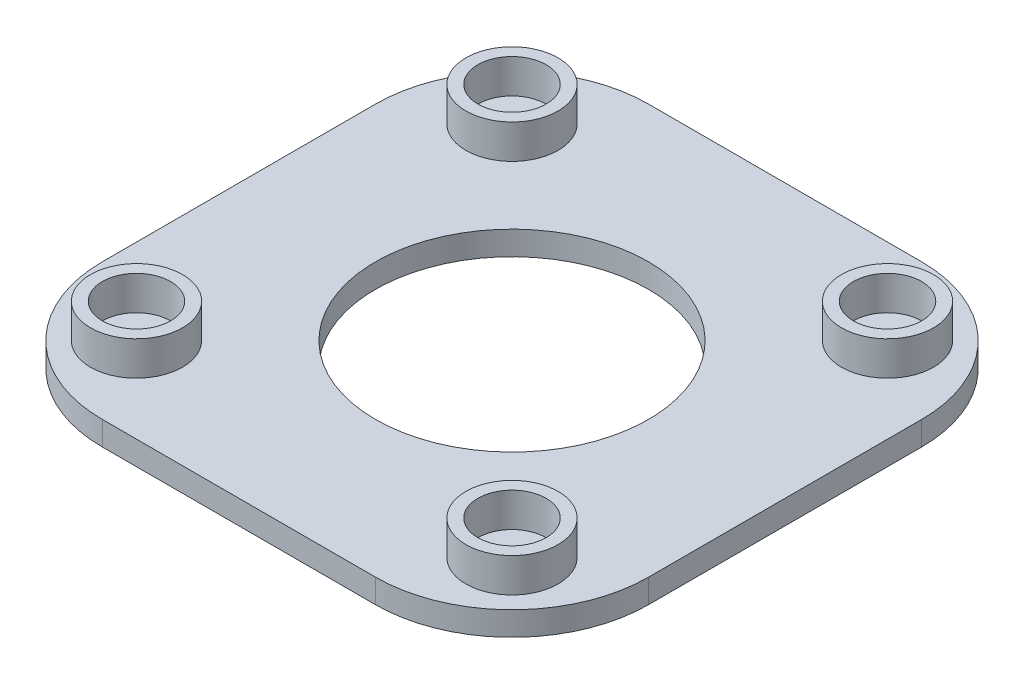
ISO-10303-21;
HEADER;
FILE_DESCRIPTION(('STEP AP214'),'2;1');
FILE_NAME('part.step','',(''),(''),'','','');
FILE_SCHEMA(('AUTOMOTIVE_DESIGN { 1 0 10303 214 1 1 1 1 }'));
ENDSEC;
DATA;
#1=APPLICATION_CONTEXT('core data for automotive mechanical design processes');
#2=APPLICATION_PROTOCOL_DEFINITION('international standard','automotive_design',2000,#1);
#3=PRODUCT_CONTEXT('',#1,'mechanical');
#4=PRODUCT('Part','Part','',(#3));
#5=PRODUCT_RELATED_PRODUCT_CATEGORY('part','',(#4));
#6=PRODUCT_DEFINITION_FORMATION('','',#4);
#7=PRODUCT_DEFINITION_CONTEXT('part definition',#1,'design');
#8=PRODUCT_DEFINITION('design','',#6,#7);
#9=PRODUCT_DEFINITION_SHAPE('','',#8);
#10=(LENGTH_UNIT() NAMED_UNIT(*) SI_UNIT(.MILLI.,.METRE.));
#11=(NAMED_UNIT(*) PLANE_ANGLE_UNIT() SI_UNIT($,.RADIAN.));
#12=(NAMED_UNIT(*) SI_UNIT($,.STERADIAN.) SOLID_ANGLE_UNIT());
#13=UNCERTAINTY_MEASURE_WITH_UNIT(LENGTH_MEASURE(1.E-05),#10,'distance_accuracy_value','');
#14=(GEOMETRIC_REPRESENTATION_CONTEXT(3) GLOBAL_UNCERTAINTY_ASSIGNED_CONTEXT((#13)) GLOBAL_UNIT_ASSIGNED_CONTEXT((#10,
#11,#12)) REPRESENTATION_CONTEXT('',''));
#15=CARTESIAN_POINT('',(0.,0.,0.));
#16=DIRECTION('',(0.,0.,1.));
#17=DIRECTION('',(1.,0.,0.));
#18=AXIS2_PLACEMENT_3D('',#15,#16,#17);
#19=CARTESIAN_POINT('',(400.,70.,-400.));
#20=DIRECTION('',(0.,1.,0.));
#21=DIRECTION('',(0.,0.,1.));
#22=AXIS2_PLACEMENT_3D('',#19,#20,#21);
#23=PLANE('',#22);
#24=CARTESIAN_POINT('',(550.,70.,550.));
#25=DIRECTION('',(0.,1.,0.));
#26=DIRECTION('',(0.,0.,1.));
#27=AXIS2_PLACEMENT_3D('',#24,#25,#26);
#28=CIRCLE('',#27,135.);
#29=CARTESIAN_POINT('',(550.,70.,685.));
#30=VERTEX_POINT('',#29);
#31=EDGE_CURVE('E426',#30,#30,#28,.T.);
#32=ORIENTED_EDGE('',*,*,#31,.F.);
#33=EDGE_LOOP('',(#32));
#34=FACE_BOUND('',#33,.T.);
#35=CARTESIAN_POINT('',(-550.,70.,550.));
#36=DIRECTION('',(0.,1.,0.));
#37=DIRECTION('',(0.,0.,1.));
#38=AXIS2_PLACEMENT_3D('',#35,#36,#37);
#39=CIRCLE('',#38,135.);
#40=CARTESIAN_POINT('',(-550.,70.,685.));
#41=VERTEX_POINT('',#40);
#42=EDGE_CURVE('E437',#41,#41,#39,.T.);
#43=ORIENTED_EDGE('',*,*,#42,.F.);
#44=EDGE_LOOP('',(#43));
#45=FACE_BOUND('',#44,.T.);
#46=CARTESIAN_POINT('',(550.,70.,-550.));
#47=DIRECTION('',(0.,1.,0.));
#48=DIRECTION('',(0.,0.,1.));
#49=AXIS2_PLACEMENT_3D('',#46,#47,#48);
#50=CIRCLE('',#49,135.);
#51=CARTESIAN_POINT('',(550.,70.,-415.));
#52=VERTEX_POINT('',#51);
#53=EDGE_CURVE('E446',#52,#52,#50,.T.);
#54=ORIENTED_EDGE('',*,*,#53,.F.);
#55=EDGE_LOOP('',(#54));
#56=FACE_BOUND('',#55,.T.);
#57=CARTESIAN_POINT('',(-550.,70.,-550.));
#58=DIRECTION('',(0.,1.,0.));
#59=DIRECTION('',(0.,0.,1.));
#60=AXIS2_PLACEMENT_3D('',#57,#58,#59);
#61=CIRCLE('',#60,135.);
#62=CARTESIAN_POINT('',(-550.,70.,-415.));
#63=VERTEX_POINT('',#62);
#64=EDGE_CURVE('E252',#63,#63,#61,.T.);
#65=ORIENTED_EDGE('',*,*,#64,.F.);
#66=EDGE_LOOP('',(#65));
#67=FACE_BOUND('',#66,.T.);
#68=CARTESIAN_POINT('',(400.,70.,-400.));
#69=DIRECTION('',(0.,1.,0.));
#70=DIRECTION('',(0.,0.,1.));
#71=AXIS2_PLACEMENT_3D('',#68,#69,#70);
#72=CIRCLE('',#71,400.);
#73=CARTESIAN_POINT('',(800.,70.,-399.999999999997));
#74=VERTEX_POINT('',#73);
#75=CARTESIAN_POINT('',(399.999999999997,70.,-800.));
#76=VERTEX_POINT('',#75);
#77=EDGE_CURVE('E146',#74,#76,#72,.T.);
#78=ORIENTED_EDGE('',*,*,#77,.T.);
#79=DIRECTION('',(-1.,0.,0.));
#80=VECTOR('',#79,1.);
#81=CARTESIAN_POINT('',(399.999999999997,70.,-800.));
#82=LINE('',#81,#80);
#83=CARTESIAN_POINT('',(-400.,70.,-800.));
#84=VERTEX_POINT('',#83);
#85=EDGE_CURVE('E94',#76,#84,#82,.T.);
#86=ORIENTED_EDGE('',*,*,#85,.T.);
#87=CARTESIAN_POINT('',(-400.,70.,-400.));
#88=DIRECTION('',(0.,1.,0.));
#89=DIRECTION('',(0.,0.,-1.));
#90=AXIS2_PLACEMENT_3D('',#87,#88,#89);
#91=CIRCLE('',#90,400.);
#92=CARTESIAN_POINT('',(-800.,70.,-399.999999999997));
#93=VERTEX_POINT('',#92);
#94=EDGE_CURVE('E258',#84,#93,#91,.T.);
#95=ORIENTED_EDGE('',*,*,#94,.T.);
#96=DIRECTION('',(0.,0.,1.));
#97=VECTOR('',#96,1.);
#98=CARTESIAN_POINT('',(-800.,70.,-399.999999999997));
#99=LINE('',#98,#97);
#100=CARTESIAN_POINT('',(-800.,70.,399.999999999997));
#101=VERTEX_POINT('',#100);
#102=EDGE_CURVE('E260',#93,#101,#99,.T.);
#103=ORIENTED_EDGE('',*,*,#102,.T.);
#104=CARTESIAN_POINT('',(-400.,70.,400.));
#105=DIRECTION('',(0.,1.,0.));
#106=DIRECTION('',(0.,0.,1.));
#107=AXIS2_PLACEMENT_3D('',#104,#105,#106);
#108=CIRCLE('',#107,400.);
#109=CARTESIAN_POINT('',(-399.999999999997,70.,800.));
#110=VERTEX_POINT('',#109);
#111=EDGE_CURVE('E113',#101,#110,#108,.T.);
#112=ORIENTED_EDGE('',*,*,#111,.T.);
#113=DIRECTION('',(1.,0.,0.));
#114=VECTOR('',#113,1.);
#115=CARTESIAN_POINT('',(-399.999999999997,70.,800.));
#116=LINE('',#115,#114);
#117=CARTESIAN_POINT('',(399.999999999997,70.,800.));
#118=VERTEX_POINT('',#117);
#119=EDGE_CURVE('E107',#110,#118,#116,.T.);
#120=ORIENTED_EDGE('',*,*,#119,.T.);
#121=CARTESIAN_POINT('',(400.,70.,400.));
#122=DIRECTION('',(0.,1.,0.));
#123=DIRECTION('',(0.,0.,-1.));
#124=AXIS2_PLACEMENT_3D('',#121,#122,#123);
#125=CIRCLE('',#124,400.);
#126=CARTESIAN_POINT('',(800.,70.,399.999999999997));
#127=VERTEX_POINT('',#126);
#128=EDGE_CURVE('E111',#118,#127,#125,.T.);
#129=ORIENTED_EDGE('',*,*,#128,.T.);
#130=DIRECTION('',(0.,0.,-1.));
#131=VECTOR('',#130,1.);
#132=CARTESIAN_POINT('',(800.,70.,-399.999999999997));
#133=LINE('',#132,#131);
#134=EDGE_CURVE('E50',#127,#74,#133,.T.);
#135=ORIENTED_EDGE('',*,*,#134,.T.);
#136=EDGE_LOOP('',(#78,#86,#95,#103,#112,#120,#129,#135));
#137=FACE_BOUND('',#136,.T.);
#138=CARTESIAN_POINT('',(0.,70.,0.));
#139=DIRECTION('',(0.,1.,0.));
#140=DIRECTION('',(0.,0.,1.));
#141=AXIS2_PLACEMENT_3D('',#138,#139,#140);
#142=CIRCLE('',#141,400.);
#143=CARTESIAN_POINT('',(0.,70.,400.));
#144=VERTEX_POINT('',#143);
#145=EDGE_CURVE('E135',#144,#144,#142,.T.);
#146=ORIENTED_EDGE('',*,*,#145,.F.);
#147=EDGE_LOOP('',(#146));
#148=FACE_BOUND('',#147,.T.);
#149=ADVANCED_FACE('F33',(#34,#45,#56,#67,#137,#148),#23,.T.);
#150=CARTESIAN_POINT('',(400.,0.,-400.));
#151=DIRECTION('',(0.,1.,0.));
#152=DIRECTION('',(0.,0.,1.));
#153=AXIS2_PLACEMENT_3D('',#150,#151,#152);
#154=PLANE('',#153);
#155=CARTESIAN_POINT('',(400.,0.,-400.));
#156=DIRECTION('',(0.,1.,0.));
#157=DIRECTION('',(0.,0.,1.));
#158=AXIS2_PLACEMENT_3D('',#155,#156,#157);
#159=CIRCLE('',#158,400.);
#160=CARTESIAN_POINT('',(800.,0.,-399.999999999997));
#161=VERTEX_POINT('',#160);
#162=CARTESIAN_POINT('',(399.999999999997,0.,-800.));
#163=VERTEX_POINT('',#162);
#164=EDGE_CURVE('E131',#161,#163,#159,.T.);
#165=ORIENTED_EDGE('',*,*,#164,.F.);
#166=DIRECTION('',(0.,0.,-1.));
#167=VECTOR('',#166,1.);
#168=CARTESIAN_POINT('',(800.,0.,-399.999999999997));
#169=LINE('',#168,#167);
#170=CARTESIAN_POINT('',(800.,0.,399.999999999997));
#171=VERTEX_POINT('',#170);
#172=EDGE_CURVE('E85',#171,#161,#169,.T.);
#173=ORIENTED_EDGE('',*,*,#172,.F.);
#174=CARTESIAN_POINT('',(400.,0.,400.));
#175=DIRECTION('',(0.,1.,0.));
#176=DIRECTION('',(0.,0.,-1.));
#177=AXIS2_PLACEMENT_3D('',#174,#175,#176);
#178=CIRCLE('',#177,400.);
#179=CARTESIAN_POINT('',(399.999999999997,0.,800.));
#180=VERTEX_POINT('',#179);
#181=EDGE_CURVE('E79',#180,#171,#178,.T.);
#182=ORIENTED_EDGE('',*,*,#181,.F.);
#183=DIRECTION('',(1.,0.,0.));
#184=VECTOR('',#183,1.);
#185=CARTESIAN_POINT('',(-399.999999999997,0.,800.));
#186=LINE('',#185,#184);
#187=CARTESIAN_POINT('',(-399.999999999997,0.,800.));
#188=VERTEX_POINT('',#187);
#189=EDGE_CURVE('E121',#188,#180,#186,.T.);
#190=ORIENTED_EDGE('',*,*,#189,.F.);
#191=CARTESIAN_POINT('',(-400.,0.,400.));
#192=DIRECTION('',(0.,1.,0.));
#193=DIRECTION('',(0.,0.,1.));
#194=AXIS2_PLACEMENT_3D('',#191,#192,#193);
#195=CIRCLE('',#194,400.);
#196=CARTESIAN_POINT('',(-800.,0.,399.999999999997));
#197=VERTEX_POINT('',#196);
#198=EDGE_CURVE('E141',#197,#188,#195,.T.);
#199=ORIENTED_EDGE('',*,*,#198,.F.);
#200=DIRECTION('',(0.,0.,1.));
#201=VECTOR('',#200,1.);
#202=CARTESIAN_POINT('',(-800.,0.,-399.999999999997));
#203=LINE('',#202,#201);
#204=CARTESIAN_POINT('',(-800.,0.,-399.999999999997));
#205=VERTEX_POINT('',#204);
#206=EDGE_CURVE('E139',#205,#197,#203,.T.);
#207=ORIENTED_EDGE('',*,*,#206,.F.);
#208=CARTESIAN_POINT('',(-400.,0.,-400.));
#209=DIRECTION('',(0.,1.,0.));
#210=DIRECTION('',(0.,0.,-1.));
#211=AXIS2_PLACEMENT_3D('',#208,#209,#210);
#212=CIRCLE('',#211,400.);
#213=CARTESIAN_POINT('',(-400.,0.,-800.));
#214=VERTEX_POINT('',#213);
#215=EDGE_CURVE('E137',#214,#205,#212,.T.);
#216=ORIENTED_EDGE('',*,*,#215,.F.);
#217=DIRECTION('',(-1.,0.,0.));
#218=VECTOR('',#217,1.);
#219=CARTESIAN_POINT('',(399.999999999997,0.,-800.));
#220=LINE('',#219,#218);
#221=EDGE_CURVE('E134',#163,#214,#220,.T.);
#222=ORIENTED_EDGE('',*,*,#221,.F.);
#223=EDGE_LOOP('',(#165,#173,#182,#190,#199,#207,#216,#222));
#224=FACE_BOUND('',#223,.T.);
#225=CARTESIAN_POINT('',(0.,0.,0.));
#226=DIRECTION('',(0.,1.,0.));
#227=DIRECTION('',(0.,0.,1.));
#228=AXIS2_PLACEMENT_3D('',#225,#226,#227);
#229=CIRCLE('',#228,400.);
#230=CARTESIAN_POINT('',(0.,0.,400.));
#231=VERTEX_POINT('',#230);
#232=EDGE_CURVE('E246',#231,#231,#229,.T.);
#233=ORIENTED_EDGE('',*,*,#232,.T.);
#234=EDGE_LOOP('',(#233));
#235=FACE_BOUND('',#234,.T.);
#236=ADVANCED_FACE('F198',(#224,#235),#154,.F.);
#237=CARTESIAN_POINT('',(400.,70.,-400.));
#238=DIRECTION('',(0.,-1.,0.));
#239=DIRECTION('',(0.,0.,-1.));
#240=AXIS2_PLACEMENT_3D('',#237,#238,#239);
#241=CYLINDRICAL_SURFACE('',#240,400.);
#242=ORIENTED_EDGE('',*,*,#164,.T.);
#243=DIRECTION('',(0.,-1.,0.));
#244=VECTOR('',#243,1.);
#245=CARTESIAN_POINT('',(399.999999999997,70.,-800.));
#246=LINE('',#245,#244);
#247=EDGE_CURVE('E159',#76,#163,#246,.T.);
#248=ORIENTED_EDGE('',*,*,#247,.F.);
#249=ORIENTED_EDGE('',*,*,#77,.F.);
#250=DIRECTION('',(0.,-1.,0.));
#251=VECTOR('',#250,1.);
#252=CARTESIAN_POINT('',(800.,70.,-399.999999999997));
#253=LINE('',#252,#251);
#254=EDGE_CURVE('E127',#74,#161,#253,.T.);
#255=ORIENTED_EDGE('',*,*,#254,.T.);
#256=EDGE_LOOP('',(#242,#248,#249,#255));
#257=FACE_BOUND('',#256,.T.);
#258=ADVANCED_FACE('F35',(#257),#241,.T.);
#259=CARTESIAN_POINT('',(399.999999999997,70.,-800.));
#260=DIRECTION('',(0.,0.,1.));
#261=DIRECTION('',(1.,0.,0.));
#262=AXIS2_PLACEMENT_3D('',#259,#260,#261);
#263=PLANE('',#262);
#264=ORIENTED_EDGE('',*,*,#221,.T.);
#265=DIRECTION('',(0.,-1.,0.));
#266=VECTOR('',#265,1.);
#267=CARTESIAN_POINT('',(-400.,70.,-800.));
#268=LINE('',#267,#266);
#269=EDGE_CURVE('E156',#84,#214,#268,.T.);
#270=ORIENTED_EDGE('',*,*,#269,.F.);
#271=ORIENTED_EDGE('',*,*,#85,.F.);
#272=ORIENTED_EDGE('',*,*,#247,.T.);
#273=EDGE_LOOP('',(#264,#270,#271,#272));
#274=FACE_BOUND('',#273,.T.);
#275=ADVANCED_FACE('F276',(#274),#263,.F.);
#276=CARTESIAN_POINT('',(-400.,70.,-400.));
#277=DIRECTION('',(0.,-1.,0.));
#278=DIRECTION('',(0.,0.,-1.));
#279=AXIS2_PLACEMENT_3D('',#276,#277,#278);
#280=CYLINDRICAL_SURFACE('',#279,400.);
#281=ORIENTED_EDGE('',*,*,#215,.T.);
#282=DIRECTION('',(0.,-1.,0.));
#283=VECTOR('',#282,1.);
#284=CARTESIAN_POINT('',(-800.,70.,-399.999999999997));
#285=LINE('',#284,#283);
#286=EDGE_CURVE('E153',#93,#205,#285,.T.);
#287=ORIENTED_EDGE('',*,*,#286,.F.);
#288=ORIENTED_EDGE('',*,*,#94,.F.);
#289=ORIENTED_EDGE('',*,*,#269,.T.);
#290=EDGE_LOOP('',(#281,#287,#288,#289));
#291=FACE_BOUND('',#290,.T.);
#292=ADVANCED_FACE('F278',(#291),#280,.T.);
#293=CARTESIAN_POINT('',(-800.,70.,-399.999999999997));
#294=DIRECTION('',(1.,0.,0.));
#295=DIRECTION('',(0.,0.,-1.));
#296=AXIS2_PLACEMENT_3D('',#293,#294,#295);
#297=PLANE('',#296);
#298=ORIENTED_EDGE('',*,*,#206,.T.);
#299=DIRECTION('',(0.,-1.,0.));
#300=VECTOR('',#299,1.);
#301=CARTESIAN_POINT('',(-800.,70.,399.999999999997));
#302=LINE('',#301,#300);
#303=EDGE_CURVE('E150',#101,#197,#302,.T.);
#304=ORIENTED_EDGE('',*,*,#303,.F.);
#305=ORIENTED_EDGE('',*,*,#102,.F.);
#306=ORIENTED_EDGE('',*,*,#286,.T.);
#307=EDGE_LOOP('',(#298,#304,#305,#306));
#308=FACE_BOUND('',#307,.T.);
#309=ADVANCED_FACE('F266',(#308),#297,.F.);
#310=CARTESIAN_POINT('',(-400.,70.,400.));
#311=DIRECTION('',(0.,-1.,0.));
#312=DIRECTION('',(0.,0.,-1.));
#313=AXIS2_PLACEMENT_3D('',#310,#311,#312);
#314=CYLINDRICAL_SURFACE('',#313,400.);
#315=ORIENTED_EDGE('',*,*,#198,.T.);
#316=DIRECTION('',(0.,-1.,0.));
#317=VECTOR('',#316,1.);
#318=CARTESIAN_POINT('',(-399.999999999997,70.,800.));
#319=LINE('',#318,#317);
#320=EDGE_CURVE('E122',#110,#188,#319,.T.);
#321=ORIENTED_EDGE('',*,*,#320,.F.);
#322=ORIENTED_EDGE('',*,*,#111,.F.);
#323=ORIENTED_EDGE('',*,*,#303,.T.);
#324=EDGE_LOOP('',(#315,#321,#322,#323));
#325=FACE_BOUND('',#324,.T.);
#326=ADVANCED_FACE('F270',(#325),#314,.T.);
#327=CARTESIAN_POINT('',(-399.999999999997,70.,800.));
#328=DIRECTION('',(0.,0.,-1.));
#329=DIRECTION('',(-1.,0.,0.));
#330=AXIS2_PLACEMENT_3D('',#327,#328,#329);
#331=PLANE('',#330);
#332=ORIENTED_EDGE('',*,*,#189,.T.);
#333=DIRECTION('',(0.,-1.,0.));
#334=VECTOR('',#333,1.);
#335=CARTESIAN_POINT('',(399.999999999997,70.,800.));
#336=LINE('',#335,#334);
#337=EDGE_CURVE('E118',#118,#180,#336,.T.);
#338=ORIENTED_EDGE('',*,*,#337,.F.);
#339=ORIENTED_EDGE('',*,*,#119,.F.);
#340=ORIENTED_EDGE('',*,*,#320,.T.);
#341=EDGE_LOOP('',(#332,#338,#339,#340));
#342=FACE_BOUND('',#341,.T.);
#343=ADVANCED_FACE('F119',(#342),#331,.F.);
#344=CARTESIAN_POINT('',(400.,70.,400.));
#345=DIRECTION('',(0.,-1.,0.));
#346=DIRECTION('',(0.,0.,-1.));
#347=AXIS2_PLACEMENT_3D('',#344,#345,#346);
#348=CYLINDRICAL_SURFACE('',#347,400.);
#349=ORIENTED_EDGE('',*,*,#181,.T.);
#350=DIRECTION('',(0.,-1.,0.));
#351=VECTOR('',#350,1.);
#352=CARTESIAN_POINT('',(800.,70.,399.999999999997));
#353=LINE('',#352,#351);
#354=EDGE_CURVE('E123',#127,#171,#353,.T.);
#355=ORIENTED_EDGE('',*,*,#354,.F.);
#356=ORIENTED_EDGE('',*,*,#128,.F.);
#357=ORIENTED_EDGE('',*,*,#337,.T.);
#358=EDGE_LOOP('',(#349,#355,#356,#357));
#359=FACE_BOUND('',#358,.T.);
#360=ADVANCED_FACE('F125',(#359),#348,.T.);
#361=CARTESIAN_POINT('',(800.,70.,-399.999999999997));
#362=DIRECTION('',(-1.,0.,0.));
#363=DIRECTION('',(0.,0.,1.));
#364=AXIS2_PLACEMENT_3D('',#361,#362,#363);
#365=PLANE('',#364);
#366=ORIENTED_EDGE('',*,*,#172,.T.);
#367=ORIENTED_EDGE('',*,*,#254,.F.);
#368=ORIENTED_EDGE('',*,*,#134,.F.);
#369=ORIENTED_EDGE('',*,*,#354,.T.);
#370=EDGE_LOOP('',(#366,#367,#368,#369));
#371=FACE_BOUND('',#370,.T.);
#372=ADVANCED_FACE('F235',(#371),#365,.F.);
#373=CARTESIAN_POINT('',(0.,70.,0.));
#374=DIRECTION('',(0.,-1.,0.));
#375=DIRECTION('',(0.,0.,-1.));
#376=AXIS2_PLACEMENT_3D('',#373,#374,#375);
#377=CYLINDRICAL_SURFACE('',#376,400.);
#378=ORIENTED_EDGE('',*,*,#145,.T.);
#379=EDGE_LOOP('',(#378));
#380=FACE_BOUND('',#379,.T.);
#381=ORIENTED_EDGE('',*,*,#232,.F.);
#382=EDGE_LOOP('',(#381));
#383=FACE_BOUND('',#382,.T.);
#384=ADVANCED_FACE('F232',(#380,#383),#377,.F.);
#385=CARTESIAN_POINT('',(-550.,170.,-550.));
#386=DIRECTION('',(0.,1.,0.));
#387=DIRECTION('',(0.,0.,1.));
#388=AXIS2_PLACEMENT_3D('',#385,#386,#387);
#389=PLANE('',#388);
#390=CARTESIAN_POINT('',(-550.,170.,-550.));
#391=DIRECTION('',(0.,1.,0.));
#392=DIRECTION('',(0.,0.,1.));
#393=AXIS2_PLACEMENT_3D('',#390,#391,#392);
#394=CIRCLE('',#393,135.);
#395=CARTESIAN_POINT('',(-550.,170.,-415.));
#396=VERTEX_POINT('',#395);
#397=EDGE_CURVE('E248',#396,#396,#394,.T.);
#398=ORIENTED_EDGE('',*,*,#397,.T.);
#399=EDGE_LOOP('',(#398));
#400=FACE_BOUND('',#399,.T.);
#401=CARTESIAN_POINT('',(-550.,170.,-550.));
#402=DIRECTION('',(0.,1.,0.));
#403=DIRECTION('',(0.,0.,1.));
#404=AXIS2_PLACEMENT_3D('',#401,#402,#403);
#405=CIRCLE('',#404,100.);
#406=CARTESIAN_POINT('',(-550.,170.,-450.));
#407=VERTEX_POINT('',#406);
#408=EDGE_CURVE('E450',#407,#407,#405,.T.);
#409=ORIENTED_EDGE('',*,*,#408,.F.);
#410=EDGE_LOOP('',(#409));
#411=FACE_BOUND('',#410,.T.);
#412=ADVANCED_FACE('F225',(#400,#411),#389,.T.);
#413=CARTESIAN_POINT('',(-550.,170.,-550.));
#414=DIRECTION('',(0.,-1.,0.));
#415=DIRECTION('',(0.,0.,-1.));
#416=AXIS2_PLACEMENT_3D('',#413,#414,#415);
#417=CYLINDRICAL_SURFACE('',#416,135.);
#418=ORIENTED_EDGE('',*,*,#397,.F.);
#419=EDGE_LOOP('',(#418));
#420=FACE_BOUND('',#419,.T.);
#421=ORIENTED_EDGE('',*,*,#64,.T.);
#422=EDGE_LOOP('',(#421));
#423=FACE_BOUND('',#422,.T.);
#424=ADVANCED_FACE('F217',(#420,#423),#417,.T.);
#425=CARTESIAN_POINT('',(-550.,170.,-550.));
#426=DIRECTION('',(0.,-1.,0.));
#427=DIRECTION('',(0.,0.,-1.));
#428=AXIS2_PLACEMENT_3D('',#425,#426,#427);
#429=CYLINDRICAL_SURFACE('',#428,100.);
#430=ORIENTED_EDGE('',*,*,#408,.T.);
#431=EDGE_LOOP('',(#430));
#432=FACE_BOUND('',#431,.T.);
#433=CARTESIAN_POINT('',(-550.,70.,-550.));
#434=DIRECTION('',(0.,1.,0.));
#435=DIRECTION('',(0.,0.,1.));
#436=AXIS2_PLACEMENT_3D('',#433,#434,#435);
#437=CIRCLE('',#436,100.);
#438=CARTESIAN_POINT('',(-550.,70.,-450.));
#439=VERTEX_POINT('',#438);
#440=EDGE_CURVE('E161',#439,#439,#437,.F.);
#441=ORIENTED_EDGE('',*,*,#440,.T.);
#442=EDGE_LOOP('',(#441));
#443=FACE_BOUND('',#442,.T.);
#444=ADVANCED_FACE('F208',(#432,#443),#429,.F.);
#445=ORIENTED_EDGE('',*,*,#440,.F.);
#446=EDGE_LOOP('',(#445));
#447=FACE_BOUND('',#446,.T.);
#448=ADVANCED_FACE('F193',(#447),#23,.T.);
#449=CARTESIAN_POINT('',(550.,170.,-550.));
#450=DIRECTION('',(0.,1.,0.));
#451=DIRECTION('',(0.,0.,1.));
#452=AXIS2_PLACEMENT_3D('',#449,#450,#451);
#453=PLANE('',#452);
#454=CARTESIAN_POINT('',(550.,170.,-550.));
#455=DIRECTION('',(0.,1.,0.));
#456=DIRECTION('',(0.,0.,1.));
#457=AXIS2_PLACEMENT_3D('',#454,#455,#456);
#458=CIRCLE('',#457,135.);
#459=CARTESIAN_POINT('',(550.,170.,-415.));
#460=VERTEX_POINT('',#459);
#461=EDGE_CURVE('E447',#460,#460,#458,.T.);
#462=ORIENTED_EDGE('',*,*,#461,.T.);
#463=EDGE_LOOP('',(#462));
#464=FACE_BOUND('',#463,.T.);
#465=CARTESIAN_POINT('',(550.,170.,-550.));
#466=DIRECTION('',(0.,1.,0.));
#467=DIRECTION('',(0.,0.,1.));
#468=AXIS2_PLACEMENT_3D('',#465,#466,#467);
#469=CIRCLE('',#468,100.);
#470=CARTESIAN_POINT('',(550.,170.,-450.));
#471=VERTEX_POINT('',#470);
#472=EDGE_CURVE('E441',#471,#471,#469,.T.);
#473=ORIENTED_EDGE('',*,*,#472,.F.);
#474=EDGE_LOOP('',(#473));
#475=FACE_BOUND('',#474,.T.);
#476=ADVANCED_FACE('F207',(#464,#475),#453,.T.);
#477=CARTESIAN_POINT('',(550.,170.,-550.));
#478=DIRECTION('',(0.,-1.,0.));
#479=DIRECTION('',(0.,0.,-1.));
#480=AXIS2_PLACEMENT_3D('',#477,#478,#479);
#481=CYLINDRICAL_SURFACE('',#480,135.);
#482=ORIENTED_EDGE('',*,*,#461,.F.);
#483=EDGE_LOOP('',(#482));
#484=FACE_BOUND('',#483,.T.);
#485=ORIENTED_EDGE('',*,*,#53,.T.);
#486=EDGE_LOOP('',(#485));
#487=FACE_BOUND('',#486,.T.);
#488=ADVANCED_FACE('F214',(#484,#487),#481,.T.);
#489=CARTESIAN_POINT('',(550.,170.,-550.));
#490=DIRECTION('',(0.,-1.,0.));
#491=DIRECTION('',(0.,0.,-1.));
#492=AXIS2_PLACEMENT_3D('',#489,#490,#491);
#493=CYLINDRICAL_SURFACE('',#492,100.);
#494=ORIENTED_EDGE('',*,*,#472,.T.);
#495=EDGE_LOOP('',(#494));
#496=FACE_BOUND('',#495,.T.);
#497=CARTESIAN_POINT('',(550.,70.,-550.));
#498=DIRECTION('',(0.,1.,0.));
#499=DIRECTION('',(0.,0.,1.));
#500=AXIS2_PLACEMENT_3D('',#497,#498,#499);
#501=CIRCLE('',#500,100.);
#502=CARTESIAN_POINT('',(550.,70.,-450.));
#503=VERTEX_POINT('',#502);
#504=EDGE_CURVE('E164',#503,#503,#501,.F.);
#505=ORIENTED_EDGE('',*,*,#504,.T.);
#506=EDGE_LOOP('',(#505));
#507=FACE_BOUND('',#506,.T.);
#508=ADVANCED_FACE('F191',(#496,#507),#493,.F.);
#509=ORIENTED_EDGE('',*,*,#504,.F.);
#510=EDGE_LOOP('',(#509));
#511=FACE_BOUND('',#510,.T.);
#512=ADVANCED_FACE('F175',(#511),#23,.T.);
#513=CARTESIAN_POINT('',(-550.,170.,550.));
#514=DIRECTION('',(0.,1.,0.));
#515=DIRECTION('',(0.,0.,1.));
#516=AXIS2_PLACEMENT_3D('',#513,#514,#515);
#517=PLANE('',#516);
#518=CARTESIAN_POINT('',(-550.,170.,550.));
#519=DIRECTION('',(0.,1.,0.));
#520=DIRECTION('',(0.,0.,1.));
#521=AXIS2_PLACEMENT_3D('',#518,#519,#520);
#522=CIRCLE('',#521,135.);
#523=CARTESIAN_POINT('',(-550.,170.,685.));
#524=VERTEX_POINT('',#523);
#525=EDGE_CURVE('E438',#524,#524,#522,.T.);
#526=ORIENTED_EDGE('',*,*,#525,.T.);
#527=EDGE_LOOP('',(#526));
#528=FACE_BOUND('',#527,.T.);
#529=CARTESIAN_POINT('',(-550.,170.,550.));
#530=DIRECTION('',(0.,1.,0.));
#531=DIRECTION('',(0.,0.,1.));
#532=AXIS2_PLACEMENT_3D('',#529,#530,#531);
#533=CIRCLE('',#532,100.);
#534=CARTESIAN_POINT('',(-550.,170.,650.));
#535=VERTEX_POINT('',#534);
#536=EDGE_CURVE('E433',#535,#535,#533,.T.);
#537=ORIENTED_EDGE('',*,*,#536,.F.);
#538=EDGE_LOOP('',(#537));
#539=FACE_BOUND('',#538,.T.);
#540=ADVANCED_FACE('F190',(#528,#539),#517,.T.);
#541=CARTESIAN_POINT('',(-550.,170.,550.));
#542=DIRECTION('',(0.,-1.,0.));
#543=DIRECTION('',(0.,0.,-1.));
#544=AXIS2_PLACEMENT_3D('',#541,#542,#543);
#545=CYLINDRICAL_SURFACE('',#544,135.);
#546=ORIENTED_EDGE('',*,*,#525,.F.);
#547=EDGE_LOOP('',(#546));
#548=FACE_BOUND('',#547,.T.);
#549=ORIENTED_EDGE('',*,*,#42,.T.);
#550=EDGE_LOOP('',(#549));
#551=FACE_BOUND('',#550,.T.);
#552=ADVANCED_FACE('F184',(#548,#551),#545,.T.);
#553=CARTESIAN_POINT('',(-550.,170.,550.));
#554=DIRECTION('',(0.,-1.,0.));
#555=DIRECTION('',(0.,0.,-1.));
#556=AXIS2_PLACEMENT_3D('',#553,#554,#555);
#557=CYLINDRICAL_SURFACE('',#556,100.);
#558=ORIENTED_EDGE('',*,*,#536,.T.);
#559=EDGE_LOOP('',(#558));
#560=FACE_BOUND('',#559,.T.);
#561=CARTESIAN_POINT('',(-550.,70.,550.));
#562=DIRECTION('',(0.,1.,0.));
#563=DIRECTION('',(0.,0.,1.));
#564=AXIS2_PLACEMENT_3D('',#561,#562,#563);
#565=CIRCLE('',#564,100.);
#566=CARTESIAN_POINT('',(-550.,70.,650.));
#567=VERTEX_POINT('',#566);
#568=EDGE_CURVE('E42',#567,#567,#565,.F.);
#569=ORIENTED_EDGE('',*,*,#568,.T.);
#570=EDGE_LOOP('',(#569));
#571=FACE_BOUND('',#570,.T.);
#572=ADVANCED_FACE('F169',(#560,#571),#557,.F.);
#573=ORIENTED_EDGE('',*,*,#568,.F.);
#574=EDGE_LOOP('',(#573));
#575=FACE_BOUND('',#574,.T.);
#576=ADVANCED_FACE('F171',(#575),#23,.T.);
#577=CARTESIAN_POINT('',(550.,170.,550.));
#578=DIRECTION('',(0.,1.,0.));
#579=DIRECTION('',(0.,0.,1.));
#580=AXIS2_PLACEMENT_3D('',#577,#578,#579);
#581=PLANE('',#580);
#582=CARTESIAN_POINT('',(550.,170.,550.));
#583=DIRECTION('',(0.,1.,0.));
#584=DIRECTION('',(0.,0.,1.));
#585=AXIS2_PLACEMENT_3D('',#582,#583,#584);
#586=CIRCLE('',#585,135.);
#587=CARTESIAN_POINT('',(550.,170.,685.));
#588=VERTEX_POINT('',#587);
#589=EDGE_CURVE('E429',#588,#588,#586,.T.);
#590=ORIENTED_EDGE('',*,*,#589,.T.);
#591=EDGE_LOOP('',(#590));
#592=FACE_BOUND('',#591,.T.);
#593=CARTESIAN_POINT('',(550.,170.,550.));
#594=DIRECTION('',(0.,1.,0.));
#595=DIRECTION('',(0.,0.,1.));
#596=AXIS2_PLACEMENT_3D('',#593,#594,#595);
#597=CIRCLE('',#596,100.);
#598=CARTESIAN_POINT('',(550.,170.,650.));
#599=VERTEX_POINT('',#598);
#600=EDGE_CURVE('E423',#599,#599,#597,.T.);
#601=ORIENTED_EDGE('',*,*,#600,.F.);
#602=EDGE_LOOP('',(#601));
#603=FACE_BOUND('',#602,.T.);
#604=ADVANCED_FACE('F173',(#592,#603),#581,.T.);
#605=CARTESIAN_POINT('',(550.,170.,550.));
#606=DIRECTION('',(0.,-1.,0.));
#607=DIRECTION('',(0.,0.,-1.));
#608=AXIS2_PLACEMENT_3D('',#605,#606,#607);
#609=CYLINDRICAL_SURFACE('',#608,135.);
#610=ORIENTED_EDGE('',*,*,#589,.F.);
#611=EDGE_LOOP('',(#610));
#612=FACE_BOUND('',#611,.T.);
#613=ORIENTED_EDGE('',*,*,#31,.T.);
#614=EDGE_LOOP('',(#613));
#615=FACE_BOUND('',#614,.T.);
#616=ADVANCED_FACE('F181',(#612,#615),#609,.T.);
#617=CARTESIAN_POINT('',(550.,170.,550.));
#618=DIRECTION('',(0.,-1.,0.));
#619=DIRECTION('',(0.,0.,-1.));
#620=AXIS2_PLACEMENT_3D('',#617,#618,#619);
#621=CYLINDRICAL_SURFACE('',#620,100.);
#622=ORIENTED_EDGE('',*,*,#600,.T.);
#623=EDGE_LOOP('',(#622));
#624=FACE_BOUND('',#623,.T.);
#625=CARTESIAN_POINT('',(550.,70.,550.));
#626=DIRECTION('',(0.,1.,0.));
#627=DIRECTION('',(0.,0.,1.));
#628=AXIS2_PLACEMENT_3D('',#625,#626,#627);
#629=CIRCLE('',#628,100.);
#630=CARTESIAN_POINT('',(550.,70.,650.));
#631=VERTEX_POINT('',#630);
#632=EDGE_CURVE('E11',#631,#631,#629,.F.);
#633=ORIENTED_EDGE('',*,*,#632,.T.);
#634=EDGE_LOOP('',(#633));
#635=FACE_BOUND('',#634,.T.);
#636=ADVANCED_FACE('F195',(#624,#635),#621,.F.);
#637=ORIENTED_EDGE('',*,*,#632,.F.);
#638=EDGE_LOOP('',(#637));
#639=FACE_BOUND('',#638,.T.);
#640=ADVANCED_FACE('F176',(#639),#23,.T.);
#641=CLOSED_SHELL('',(#149,#236,#258,#275,#292,#309,#326,#343,#360,#372,#384,#412,#424,#444,
#448,#476,#488,#508,#512,#540,#552,#572,#576,#604,#616,#636,#640));
#642=MANIFOLD_SOLID_BREP('B2',#641);
#643=ADVANCED_BREP_SHAPE_REPRESENTATION('',(#18,#642),#14);
#644=SHAPE_DEFINITION_REPRESENTATION(#9,#643);
ENDSEC;
END-ISO-10303-21;
